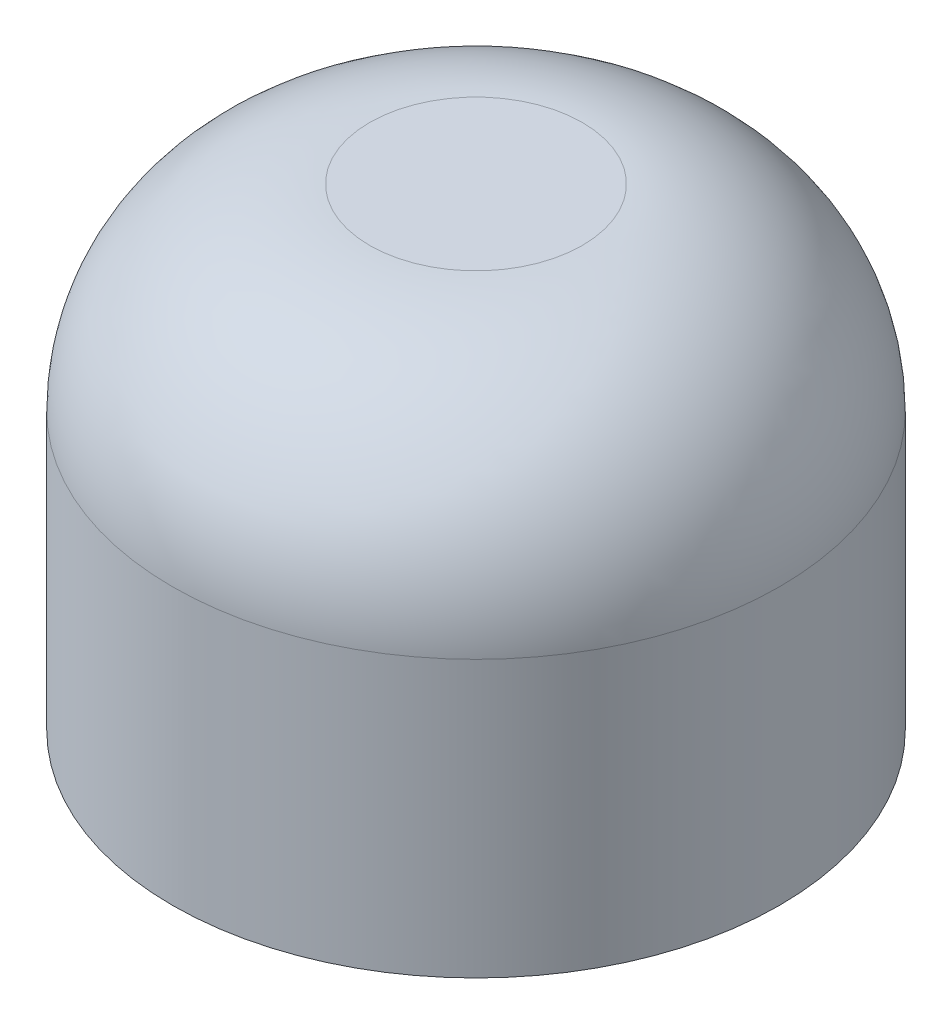
ISO-10303-21;
HEADER;
FILE_DESCRIPTION(('STEP AP214'),'2;1');
FILE_NAME('part.step','',(''),(''),'','','');
FILE_SCHEMA(('AUTOMOTIVE_DESIGN { 1 0 10303 214 1 1 1 1 }'));
ENDSEC;
DATA;
#1=APPLICATION_CONTEXT('core data for automotive mechanical design processes');
#2=APPLICATION_PROTOCOL_DEFINITION('international standard','automotive_design',2000,#1);
#3=PRODUCT_CONTEXT('',#1,'mechanical');
#4=PRODUCT('Part','Part','',(#3));
#5=PRODUCT_RELATED_PRODUCT_CATEGORY('part','',(#4));
#6=PRODUCT_DEFINITION_FORMATION('','',#4);
#7=PRODUCT_DEFINITION_CONTEXT('part definition',#1,'design');
#8=PRODUCT_DEFINITION('design','',#6,#7);
#9=PRODUCT_DEFINITION_SHAPE('','',#8);
#10=(LENGTH_UNIT() NAMED_UNIT(*) SI_UNIT(.MILLI.,.METRE.));
#11=(NAMED_UNIT(*) PLANE_ANGLE_UNIT() SI_UNIT($,.RADIAN.));
#12=(NAMED_UNIT(*) SI_UNIT($,.STERADIAN.) SOLID_ANGLE_UNIT());
#13=UNCERTAINTY_MEASURE_WITH_UNIT(LENGTH_MEASURE(1.E-05),#10,'distance_accuracy_value','');
#14=(GEOMETRIC_REPRESENTATION_CONTEXT(3) GLOBAL_UNCERTAINTY_ASSIGNED_CONTEXT((#13)) GLOBAL_UNIT_ASSIGNED_CONTEXT((#10,
#11,#12)) REPRESENTATION_CONTEXT('',''));
#15=CARTESIAN_POINT('',(0.,0.,0.));
#16=DIRECTION('',(0.,0.,1.));
#17=DIRECTION('',(1.,0.,0.));
#18=AXIS2_PLACEMENT_3D('',#15,#16,#17);
#19=CARTESIAN_POINT('',(0.,3.,0.));
#20=DIRECTION('',(0.,-1.,0.));
#21=DIRECTION('',(0.,0.,-1.));
#22=AXIS2_PLACEMENT_3D('',#19,#20,#21);
#23=CYLINDRICAL_SURFACE('',#22,1.925);
#24=CARTESIAN_POINT('',(0.,1.75,0.));
#25=DIRECTION('',(0.,1.,0.));
#26=DIRECTION('',(0.,0.,1.));
#27=AXIS2_PLACEMENT_3D('',#24,#25,#26);
#28=CIRCLE('',#27,1.925);
#29=CARTESIAN_POINT('',(0.,1.75,1.925));
#30=VERTEX_POINT('',#29);
#31=EDGE_CURVE('E10',#30,#30,#28,.F.);
#32=ORIENTED_EDGE('',*,*,#31,.T.);
#33=EDGE_LOOP('',(#32));
#34=FACE_BOUND('',#33,.T.);
#35=CARTESIAN_POINT('',(0.,0.,0.));
#36=DIRECTION('',(0.,1.,0.));
#37=DIRECTION('',(0.,0.,1.));
#38=AXIS2_PLACEMENT_3D('',#35,#36,#37);
#39=CIRCLE('',#38,1.925);
#40=CARTESIAN_POINT('',(0.,0.,1.925));
#41=VERTEX_POINT('',#40);
#42=EDGE_CURVE('E52',#41,#41,#39,.T.);
#43=ORIENTED_EDGE('',*,*,#42,.T.);
#44=EDGE_LOOP('',(#43));
#45=FACE_BOUND('',#44,.T.);
#46=ADVANCED_FACE('F39',(#34,#45),#23,.T.);
#47=CARTESIAN_POINT('',(0.,3.,0.));
#48=DIRECTION('',(0.,1.,0.));
#49=DIRECTION('',(0.,0.,1.));
#50=AXIS2_PLACEMENT_3D('',#47,#48,#49);
#51=PLANE('',#50);
#52=CARTESIAN_POINT('',(0.,3.,0.));
#53=DIRECTION('',(0.,1.,0.));
#54=DIRECTION('',(0.,0.,1.));
#55=AXIS2_PLACEMENT_3D('',#52,#53,#54);
#56=CIRCLE('',#55,0.675);
#57=CARTESIAN_POINT('',(0.,3.,0.675));
#58=VERTEX_POINT('',#57);
#59=EDGE_CURVE('E47',#58,#58,#56,.T.);
#60=ORIENTED_EDGE('',*,*,#59,.T.);
#61=EDGE_LOOP('',(#60));
#62=FACE_BOUND('',#61,.T.);
#63=ADVANCED_FACE('F63',(#62),#51,.T.);
#64=CARTESIAN_POINT('',(0.,0.,0.));
#65=DIRECTION('',(0.,1.,0.));
#66=DIRECTION('',(0.,0.,1.));
#67=AXIS2_PLACEMENT_3D('',#64,#65,#66);
#68=PLANE('',#67);
#69=ORIENTED_EDGE('',*,*,#42,.F.);
#70=EDGE_LOOP('',(#69));
#71=FACE_BOUND('',#70,.T.);
#72=ADVANCED_FACE('F61',(#71),#68,.F.);
#73=CARTESIAN_POINT('',(0.,1.75,0.));
#74=DIRECTION('',(0.,1.,0.));
#75=DIRECTION('',(0.,0.,1.));
#76=AXIS2_PLACEMENT_3D('',#73,#74,#75);
#77=DEGENERATE_TOROIDAL_SURFACE('',#76,0.675,1.25,.T.);
#78=ORIENTED_EDGE('',*,*,#31,.F.);
#79=EDGE_LOOP('',(#78));
#80=FACE_BOUND('',#79,.T.);
#81=ORIENTED_EDGE('',*,*,#59,.F.);
#82=EDGE_LOOP('',(#81));
#83=FACE_BOUND('',#82,.T.);
#84=ADVANCED_FACE('F41',(#80,#83),#77,.T.);
#85=CLOSED_SHELL('',(#46,#63,#72,#84));
#86=MANIFOLD_SOLID_BREP('B2',#85);
#87=ADVANCED_BREP_SHAPE_REPRESENTATION('',(#18,#86),#14);
#88=SHAPE_DEFINITION_REPRESENTATION(#9,#87);
ENDSEC;
END-ISO-10303-21;
